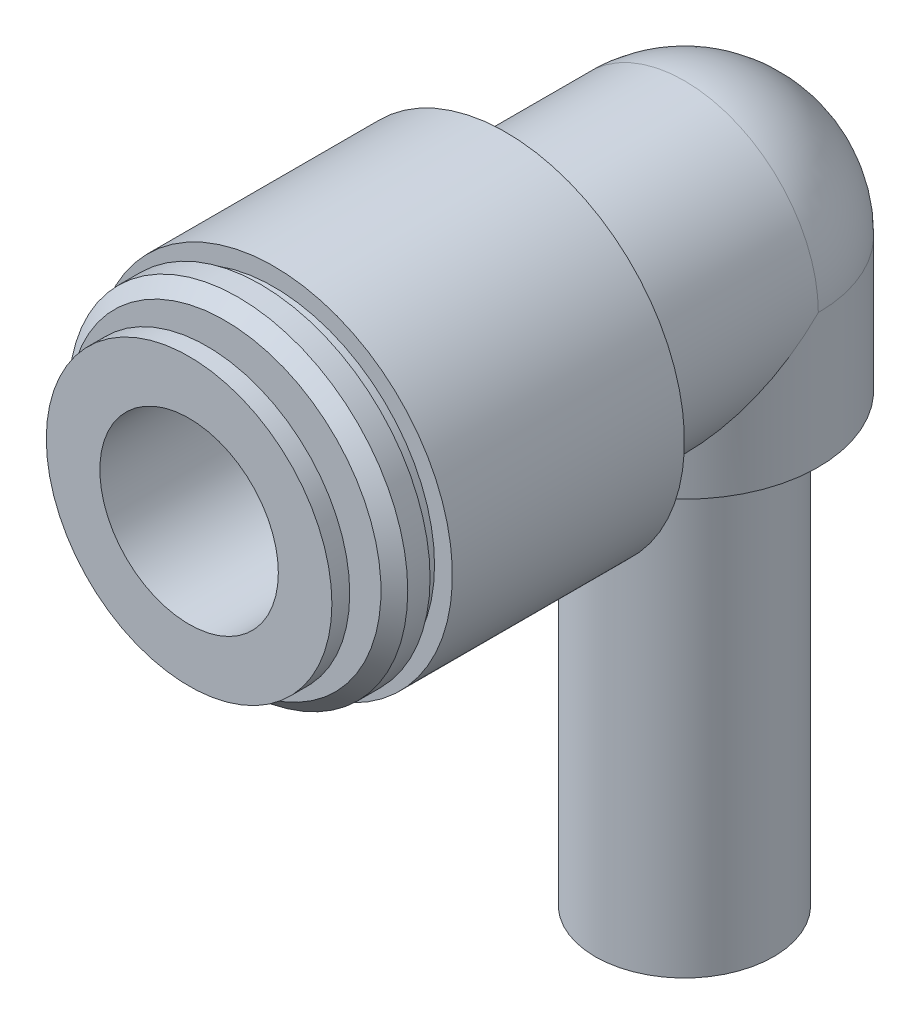
ISO-10303-21;
HEADER;
FILE_DESCRIPTION(('STEP AP214'),'2;1');
FILE_NAME('part.step','',(''),(''),'','','');
FILE_SCHEMA(('AUTOMOTIVE_DESIGN { 1 0 10303 214 1 1 1 1 }'));
ENDSEC;
DATA;
#1=APPLICATION_CONTEXT('core data for automotive mechanical design processes');
#2=APPLICATION_PROTOCOL_DEFINITION('international standard','automotive_design',2000,#1);
#3=PRODUCT_CONTEXT('',#1,'mechanical');
#4=PRODUCT('Part','Part','',(#3));
#5=PRODUCT_RELATED_PRODUCT_CATEGORY('part','',(#4));
#6=PRODUCT_DEFINITION_FORMATION('','',#4);
#7=PRODUCT_DEFINITION_CONTEXT('part definition',#1,'design');
#8=PRODUCT_DEFINITION('design','',#6,#7);
#9=PRODUCT_DEFINITION_SHAPE('','',#8);
#10=(LENGTH_UNIT() NAMED_UNIT(*) SI_UNIT(.MILLI.,.METRE.));
#11=(NAMED_UNIT(*) PLANE_ANGLE_UNIT() SI_UNIT($,.RADIAN.));
#12=(NAMED_UNIT(*) SI_UNIT($,.STERADIAN.) SOLID_ANGLE_UNIT());
#13=UNCERTAINTY_MEASURE_WITH_UNIT(LENGTH_MEASURE(1.E-05),#10,'distance_accuracy_value','');
#14=(GEOMETRIC_REPRESENTATION_CONTEXT(3) GLOBAL_UNCERTAINTY_ASSIGNED_CONTEXT((#13)) GLOBAL_UNIT_ASSIGNED_CONTEXT((#10,
#11,#12)) REPRESENTATION_CONTEXT('',''));
#15=CARTESIAN_POINT('',(0.,0.,0.));
#16=DIRECTION('',(0.,0.,1.));
#17=DIRECTION('',(1.,0.,0.));
#18=AXIS2_PLACEMENT_3D('',#15,#16,#17);
#19=CARTESIAN_POINT('',(0.,25.,0.));
#20=DIRECTION('',(0.,-1.,0.));
#21=DIRECTION('',(0.,0.,-1.));
#22=AXIS2_PLACEMENT_3D('',#19,#20,#21);
#23=CYLINDRICAL_SURFACE('',#22,7.5);
#24=CARTESIAN_POINT('',(0.,32.5,0.));
#25=DIRECTION('',(0.,-1.,0.));
#26=DIRECTION('',(0.,0.,-1.));
#27=AXIS2_PLACEMENT_3D('',#24,#25,#26);
#28=CIRCLE('',#27,7.5);
#29=CARTESIAN_POINT('',(-7.5,32.5,0.));
#30=VERTEX_POINT('',#29);
#31=CARTESIAN_POINT('',(7.5,32.5,0.));
#32=VERTEX_POINT('',#31);
#33=EDGE_CURVE('E68',#30,#32,#28,.T.);
#34=ORIENTED_EDGE('',*,*,#33,.T.);
#35=CARTESIAN_POINT('',(0.,32.5,0.));
#36=DIRECTION('',(0.,-0.707106781186547,-0.707106781186547));
#37=DIRECTION('',(0.,-0.707106781186547,0.707106781186547));
#38=AXIS2_PLACEMENT_3D('',#35,#36,#37);
#39=ELLIPSE('',#38,10.6066017177982,7.5);
#40=CARTESIAN_POINT('',(0.,25.,7.5));
#41=VERTEX_POINT('',#40);
#42=EDGE_CURVE('E51',#32,#41,#39,.T.);
#43=ORIENTED_EDGE('',*,*,#42,.T.);
#44=CARTESIAN_POINT('',(0.,25.,0.));
#45=DIRECTION('',(0.,-1.,0.));
#46=DIRECTION('',(0.,0.,-1.));
#47=AXIS2_PLACEMENT_3D('',#44,#45,#46);
#48=CIRCLE('',#47,7.5);
#49=EDGE_CURVE('E70',#41,#41,#48,.T.);
#50=ORIENTED_EDGE('',*,*,#49,.F.);
#51=EDGE_CURVE('E55',#41,#30,#39,.T.);
#52=ORIENTED_EDGE('',*,*,#51,.T.);
#53=EDGE_LOOP('',(#34,#43,#50,#52));
#54=FACE_BOUND('',#53,.T.);
#55=ADVANCED_FACE('F36',(#54),#23,.T.);
#56=CARTESIAN_POINT('',(0.,32.5,0.));
#57=DIRECTION('',(0.,-1.,0.));
#58=DIRECTION('',(1.,0.,0.));
#59=AXIS2_PLACEMENT_3D('',#56,#57,#58);
#60=SPHERICAL_SURFACE('',#59,7.5);
#61=ORIENTED_EDGE('',*,*,#33,.F.);
#62=CARTESIAN_POINT('',(0.,32.5,0.));
#63=DIRECTION('',(0.,0.,1.));
#64=DIRECTION('',(1.,0.,0.));
#65=AXIS2_PLACEMENT_3D('',#62,#63,#64);
#66=CIRCLE('',#65,7.5);
#67=EDGE_CURVE('E57',#32,#30,#66,.T.);
#68=ORIENTED_EDGE('',*,*,#67,.F.);
#69=EDGE_LOOP('',(#61,#68));
#70=FACE_BOUND('',#69,.T.);
#71=ADVANCED_FACE('F72',(#70),#60,.T.);
#72=CARTESIAN_POINT('',(0.,0.,0.));
#73=DIRECTION('',(0.,1.,0.));
#74=DIRECTION('',(0.,0.,1.));
#75=AXIS2_PLACEMENT_3D('',#72,#73,#74);
#76=PLANE('',#75);
#77=CARTESIAN_POINT('',(0.,0.,0.));
#78=DIRECTION('',(0.,1.,0.));
#79=DIRECTION('',(0.,0.,1.));
#80=AXIS2_PLACEMENT_3D('',#77,#78,#79);
#81=CIRCLE('',#80,5.);
#82=CARTESIAN_POINT('',(0.,0.,5.));
#83=VERTEX_POINT('',#82);
#84=EDGE_CURVE('E40',#83,#83,#81,.T.);
#85=ORIENTED_EDGE('',*,*,#84,.F.);
#86=EDGE_LOOP('',(#85));
#87=FACE_BOUND('',#86,.T.);
#88=CARTESIAN_POINT('',(0.,0.,0.));
#89=DIRECTION('',(0.,1.,0.));
#90=DIRECTION('',(0.,0.,1.));
#91=AXIS2_PLACEMENT_3D('',#88,#89,#90);
#92=CIRCLE('',#91,4.);
#93=CARTESIAN_POINT('',(0.,0.,4.));
#94=VERTEX_POINT('',#93);
#95=EDGE_CURVE('E79',#94,#94,#92,.T.);
#96=ORIENTED_EDGE('',*,*,#95,.T.);
#97=EDGE_LOOP('',(#96));
#98=FACE_BOUND('',#97,.T.);
#99=ADVANCED_FACE('F87',(#87,#98),#76,.F.);
#100=CARTESIAN_POINT('',(0.,25.,0.));
#101=DIRECTION('',(0.,-1.,0.));
#102=DIRECTION('',(0.,0.,-1.));
#103=AXIS2_PLACEMENT_3D('',#100,#101,#102);
#104=CYLINDRICAL_SURFACE('',#103,5.);
#105=CARTESIAN_POINT('',(0.,25.,0.));
#106=DIRECTION('',(0.,1.,0.));
#107=DIRECTION('',(0.,0.,1.));
#108=AXIS2_PLACEMENT_3D('',#105,#106,#107);
#109=CIRCLE('',#108,5.);
#110=CARTESIAN_POINT('',(0.,25.,5.));
#111=VERTEX_POINT('',#110);
#112=EDGE_CURVE('E11',#111,#111,#109,.T.);
#113=ORIENTED_EDGE('',*,*,#112,.F.);
#114=EDGE_LOOP('',(#113));
#115=FACE_BOUND('',#114,.T.);
#116=ORIENTED_EDGE('',*,*,#84,.T.);
#117=EDGE_LOOP('',(#116));
#118=FACE_BOUND('',#117,.T.);
#119=ADVANCED_FACE('F38',(#115,#118),#104,.T.);
#120=CARTESIAN_POINT('',(0.,25.,0.));
#121=DIRECTION('',(0.,-1.,0.));
#122=DIRECTION('',(0.,0.,-1.));
#123=AXIS2_PLACEMENT_3D('',#120,#121,#122);
#124=CYLINDRICAL_SURFACE('',#123,4.);
#125=CARTESIAN_POINT('',(0.,25.,0.));
#126=DIRECTION('',(0.,1.,0.));
#127=DIRECTION('',(0.,0.,1.));
#128=AXIS2_PLACEMENT_3D('',#125,#126,#127);
#129=CIRCLE('',#128,4.);
#130=CARTESIAN_POINT('',(0.,25.,4.));
#131=VERTEX_POINT('',#130);
#132=EDGE_CURVE('E74',#131,#131,#129,.T.);
#133=ORIENTED_EDGE('',*,*,#132,.T.);
#134=EDGE_LOOP('',(#133));
#135=FACE_BOUND('',#134,.T.);
#136=ORIENTED_EDGE('',*,*,#95,.F.);
#137=EDGE_LOOP('',(#136));
#138=FACE_BOUND('',#137,.T.);
#139=ADVANCED_FACE('F93',(#135,#138),#124,.F.);
#140=CARTESIAN_POINT('',(0.,25.,0.));
#141=DIRECTION('',(0.,-1.,0.));
#142=DIRECTION('',(0.,0.,-1.));
#143=AXIS2_PLACEMENT_3D('',#140,#141,#142);
#144=PLANE('',#143);
#145=ORIENTED_EDGE('',*,*,#132,.F.);
#146=EDGE_LOOP('',(#145));
#147=FACE_BOUND('',#146,.T.);
#148=ADVANCED_FACE('F105',(#147),#144,.T.);
#149=ORIENTED_EDGE('',*,*,#49,.T.);
#150=EDGE_LOOP('',(#149));
#151=FACE_BOUND('',#150,.T.);
#152=ORIENTED_EDGE('',*,*,#112,.T.);
#153=EDGE_LOOP('',(#152));
#154=FACE_BOUND('',#153,.T.);
#155=ADVANCED_FACE('F103',(#151,#154),#144,.T.);
#156=CARTESIAN_POINT('',(0.,32.5,10.));
#157=DIRECTION('',(0.,0.,-1.));
#158=DIRECTION('',(-1.,0.,0.));
#159=AXIS2_PLACEMENT_3D('',#156,#157,#158);
#160=CYLINDRICAL_SURFACE('',#159,7.5);
#161=ORIENTED_EDGE('',*,*,#42,.F.);
#162=ORIENTED_EDGE('',*,*,#67,.T.);
#163=ORIENTED_EDGE('',*,*,#51,.F.);
#164=EDGE_LOOP('',(#161,#162,#163));
#165=FACE_BOUND('',#164,.T.);
#166=CARTESIAN_POINT('',(0.,32.5,10.));
#167=DIRECTION('',(0.,0.,1.));
#168=DIRECTION('',(1.,0.,0.));
#169=AXIS2_PLACEMENT_3D('',#166,#167,#168);
#170=CIRCLE('',#169,7.5);
#171=CARTESIAN_POINT('',(7.5,32.5,10.));
#172=VERTEX_POINT('',#171);
#173=EDGE_CURVE('E63',#172,#172,#170,.T.);
#174=ORIENTED_EDGE('',*,*,#173,.F.);
#175=EDGE_LOOP('',(#174));
#176=FACE_BOUND('',#175,.T.);
#177=ADVANCED_FACE('F58',(#165,#176),#160,.T.);
#178=CARTESIAN_POINT('',(0.,32.5,23.));
#179=DIRECTION('',(0.,0.,-1.));
#180=DIRECTION('',(-1.,0.,0.));
#181=AXIS2_PLACEMENT_3D('',#178,#179,#180);
#182=CYLINDRICAL_SURFACE('',#181,10.);
#183=CARTESIAN_POINT('',(0.,32.5,23.));
#184=DIRECTION('',(0.,0.,1.));
#185=DIRECTION('',(1.,0.,0.));
#186=AXIS2_PLACEMENT_3D('',#183,#184,#185);
#187=CIRCLE('',#186,10.);
#188=CARTESIAN_POINT('',(-10.,32.5,23.));
#189=VERTEX_POINT('',#188);
#190=EDGE_CURVE('E64',#189,#189,#187,.T.);
#191=CARTESIAN_POINT('',(0.,32.5,10.));
#192=DIRECTION('',(0.,0.,1.));
#193=DIRECTION('',(1.,0.,0.));
#194=AXIS2_PLACEMENT_3D('',#191,#192,#193);
#195=CIRCLE('',#194,10.);
#196=CARTESIAN_POINT('',(-10.,32.5,10.));
#197=VERTEX_POINT('',#196);
#198=EDGE_CURVE('E339',#197,#197,#195,.T.);
#199=CARTESIAN_POINT('',(-10.,32.5,23.));
#200=CARTESIAN_POINT('',(-10.,32.5,22.8645833333333));
#201=CARTESIAN_POINT('',(-10.,32.5,22.7291666666667));
#202=CARTESIAN_POINT('',(-10.,32.5,22.4583333333333));
#203=CARTESIAN_POINT('',(-10.,32.5,22.3229166666667));
#204=CARTESIAN_POINT('',(-10.,32.5,22.0520833333333));
#205=CARTESIAN_POINT('',(-10.,32.5,21.9166666666667));
#206=CARTESIAN_POINT('',(-10.,32.5,21.6458333333333));
#207=CARTESIAN_POINT('',(-10.,32.5,21.5104166666667));
#208=CARTESIAN_POINT('',(-10.,32.5,21.2395833333333));
#209=CARTESIAN_POINT('',(-10.,32.5,21.1041666666667));
#210=CARTESIAN_POINT('',(-10.,32.5,20.8333333333333));
#211=CARTESIAN_POINT('',(-10.,32.5,20.6979166666667));
#212=CARTESIAN_POINT('',(-10.,32.5,20.4270833333333));
#213=CARTESIAN_POINT('',(-10.,32.5,20.2916666666667));
#214=CARTESIAN_POINT('',(-10.,32.5,20.0208333333333));
#215=CARTESIAN_POINT('',(-10.,32.5,19.8854166666667));
#216=CARTESIAN_POINT('',(-10.,32.5,19.6145833333333));
#217=CARTESIAN_POINT('',(-10.,32.5,19.4791666666667));
#218=CARTESIAN_POINT('',(-10.,32.5,19.2083333333333));
#219=CARTESIAN_POINT('',(-10.,32.5,19.0729166666667));
#220=CARTESIAN_POINT('',(-10.,32.5,18.8020833333333));
#221=CARTESIAN_POINT('',(-10.,32.5,18.6666666666667));
#222=CARTESIAN_POINT('',(-10.,32.5,18.3958333333333));
#223=CARTESIAN_POINT('',(-10.,32.5,18.2604166666667));
#224=CARTESIAN_POINT('',(-10.,32.5,17.9895833333333));
#225=CARTESIAN_POINT('',(-10.,32.5,17.8541666666667));
#226=CARTESIAN_POINT('',(-10.,32.5,17.5833333333333));
#227=CARTESIAN_POINT('',(-10.,32.5,17.4479166666667));
#228=CARTESIAN_POINT('',(-10.,32.5,17.1770833333333));
#229=CARTESIAN_POINT('',(-10.,32.5,17.0416666666667));
#230=CARTESIAN_POINT('',(-10.,32.5,16.7708333333333));
#231=CARTESIAN_POINT('',(-10.,32.5,16.6354166666667));
#232=CARTESIAN_POINT('',(-10.,32.5,16.3645833333333));
#233=CARTESIAN_POINT('',(-10.,32.5,16.2291666666667));
#234=CARTESIAN_POINT('',(-10.,32.5,15.9583333333333));
#235=CARTESIAN_POINT('',(-10.,32.5,15.8229166666667));
#236=CARTESIAN_POINT('',(-10.,32.5,15.5520833333333));
#237=CARTESIAN_POINT('',(-10.,32.5,15.4166666666667));
#238=CARTESIAN_POINT('',(-10.,32.5,15.1458333333333));
#239=CARTESIAN_POINT('',(-10.,32.5,15.0104166666667));
#240=CARTESIAN_POINT('',(-10.,32.5,14.7395833333333));
#241=CARTESIAN_POINT('',(-10.,32.5,14.6041666666667));
#242=CARTESIAN_POINT('',(-10.,32.5,14.3333333333333));
#243=CARTESIAN_POINT('',(-10.,32.5,14.1979166666667));
#244=CARTESIAN_POINT('',(-10.,32.5,13.9270833333333));
#245=CARTESIAN_POINT('',(-10.,32.5,13.7916666666667));
#246=CARTESIAN_POINT('',(-10.,32.5,13.5208333333333));
#247=CARTESIAN_POINT('',(-10.,32.5,13.3854166666667));
#248=CARTESIAN_POINT('',(-10.,32.5,13.1145833333333));
#249=CARTESIAN_POINT('',(-10.,32.5,12.9791666666667));
#250=CARTESIAN_POINT('',(-10.,32.5,12.7083333333333));
#251=CARTESIAN_POINT('',(-10.,32.5,12.5729166666667));
#252=CARTESIAN_POINT('',(-10.,32.5,12.3020833333333));
#253=CARTESIAN_POINT('',(-10.,32.5,12.1666666666667));
#254=CARTESIAN_POINT('',(-10.,32.5,11.8958333333333));
#255=CARTESIAN_POINT('',(-10.,32.5,11.7604166666667));
#256=CARTESIAN_POINT('',(-10.,32.5,11.4895833333333));
#257=CARTESIAN_POINT('',(-10.,32.5,11.3541666666667));
#258=CARTESIAN_POINT('',(-10.,32.5,11.0833333333333));
#259=CARTESIAN_POINT('',(-10.,32.5,10.9479166666667));
#260=CARTESIAN_POINT('',(-10.,32.5,10.6770833333333));
#261=CARTESIAN_POINT('',(-10.,32.5,10.5416666666667));
#262=CARTESIAN_POINT('',(-10.,32.5,10.2708333333333));
#263=CARTESIAN_POINT('',(-10.,32.5,10.1354166666667));
#264=CARTESIAN_POINT('',(-10.,32.5,10.));
#265=B_SPLINE_CURVE_WITH_KNOTS('',3,(#199,#200,#201,#202,#203,#204,#205,#206,#207,#208,#209,
#210,#211,#212,#213,#214,#215,#216,#217,#218,#219,#220,#221,#222,#223,#224,#225,#226,#227,#228,
#229,#230,#231,#232,#233,#234,#235,#236,#237,#238,#239,#240,#241,#242,#243,#244,#245,#246,#247,
#248,#249,#250,#251,#252,#253,#254,#255,#256,#257,#258,#259,#260,#261,#262,#263,#264),
.UNSPECIFIED.,.F.,.F.,(4,2,2,2,2,2,2,2,2,2,2,2,2,2,2,2,2,2,2,2,2,2,2,2,2,2,2,2,2,2,2,2,4),(0.,
0.406249999999997,0.812499999999997,1.21875,1.625,2.03125,2.4375,2.84375,3.25,3.65625,4.0625,
4.46875,4.875,5.28125,5.6875,6.09375,6.5,6.90625,7.3125,7.71875,8.125,8.53124999999999,8.9375,
9.34375,9.75,10.15625,10.5625,10.96875,11.375,11.78125,12.1875,12.59375,13.),.UNSPECIFIED.);
#266=EDGE_CURVE('BSEAM127',#189,#197,#265,.T.);
#267=ORIENTED_EDGE('',*,*,#190,.F.);
#268=ORIENTED_EDGE('',*,*,#198,.T.);
#269=ORIENTED_EDGE('',*,*,#266,.T.);
#270=ORIENTED_EDGE('',*,*,#266,.F.);
#271=EDGE_LOOP('',(#267,#269,#268,#270));
#272=FACE_BOUND('',#271,.T.);
#273=ADVANCED_FACE('F127',(#272),#182,.T.);
#274=CARTESIAN_POINT('',(0.,32.5,23.));
#275=DIRECTION('',(0.,0.,1.));
#276=DIRECTION('',(1.,0.,0.));
#277=AXIS2_PLACEMENT_3D('',#274,#275,#276);
#278=PLANE('',#277);
#279=CARTESIAN_POINT('',(0.,32.5,23.));
#280=DIRECTION('',(0.,0.,-1.));
#281=DIRECTION('',(-1.,0.,0.));
#282=AXIS2_PLACEMENT_3D('',#279,#280,#281);
#283=CIRCLE('',#282,8.99999999999996);
#284=CARTESIAN_POINT('',(-8.99999999999996,32.5,23.));
#285=VERTEX_POINT('',#284);
#286=EDGE_CURVE('E307',#285,#285,#283,.T.);
#287=ORIENTED_EDGE('',*,*,#286,.T.);
#288=EDGE_LOOP('',(#287));
#289=FACE_BOUND('',#288,.T.);
#290=ORIENTED_EDGE('',*,*,#190,.T.);
#291=EDGE_LOOP('',(#290));
#292=FACE_BOUND('',#291,.T.);
#293=ADVANCED_FACE('F133',(#289,#292),#278,.T.);
#294=CARTESIAN_POINT('',(0.,32.5,10.));
#295=DIRECTION('',(0.,0.,1.));
#296=DIRECTION('',(1.,0.,0.));
#297=AXIS2_PLACEMENT_3D('',#294,#295,#296);
#298=PLANE('',#297);
#299=ORIENTED_EDGE('',*,*,#173,.T.);
#300=EDGE_LOOP('',(#299));
#301=FACE_BOUND('',#300,.T.);
#302=ORIENTED_EDGE('',*,*,#198,.F.);
#303=EDGE_LOOP('',(#302));
#304=FACE_BOUND('',#303,.T.);
#305=ADVANCED_FACE('F142',(#301,#304),#298,.F.);
#306=CARTESIAN_POINT('',(0.,28.5,27.75));
#307=DIRECTION('',(0.,0.,-1.));
#308=DIRECTION('',(-1.,0.,0.));
#309=AXIS2_PLACEMENT_3D('',#306,#307,#308);
#310=PLANE('',#309);
#311=CARTESIAN_POINT('',(0.,32.5,27.75));
#312=DIRECTION('',(0.,0.,1.));
#313=DIRECTION('',(1.,0.,0.));
#314=AXIS2_PLACEMENT_3D('',#311,#312,#313);
#315=CIRCLE('',#314,5.);
#316=CARTESIAN_POINT('',(5.,32.5,27.75));
#317=VERTEX_POINT('',#316);
#318=EDGE_CURVE('E308',#317,#317,#315,.T.);
#319=ORIENTED_EDGE('',*,*,#318,.F.);
#320=EDGE_LOOP('',(#319));
#321=FACE_BOUND('',#320,.T.);
#322=CARTESIAN_POINT('',(0.,32.5,27.75));
#323=DIRECTION('',(0.,0.,-1.));
#324=DIRECTION('',(-1.,0.,0.));
#325=AXIS2_PLACEMENT_3D('',#322,#323,#324);
#326=CIRCLE('',#325,8.);
#327=CARTESIAN_POINT('',(-8.,32.5,27.75));
#328=VERTEX_POINT('',#327);
#329=EDGE_CURVE('E336',#328,#328,#326,.T.);
#330=ORIENTED_EDGE('',*,*,#329,.F.);
#331=EDGE_LOOP('',(#330));
#332=FACE_BOUND('',#331,.T.);
#333=ADVANCED_FACE('F150',(#321,#332),#310,.F.);
#334=CARTESIAN_POINT('',(0.,32.5,23.));
#335=DIRECTION('',(0.,0.,-1.));
#336=DIRECTION('',(-1.,0.,0.));
#337=AXIS2_PLACEMENT_3D('',#334,#335,#336);
#338=CYLINDRICAL_SURFACE('',#337,8.);
#339=CARTESIAN_POINT('',(0.,32.5,26.7499999999999));
#340=DIRECTION('',(0.,0.,-1.));
#341=DIRECTION('',(-1.,0.,0.));
#342=AXIS2_PLACEMENT_3D('',#339,#340,#341);
#343=CIRCLE('',#342,8.);
#344=CARTESIAN_POINT('',(-8.,32.5,26.7499999999999));
#345=VERTEX_POINT('',#344);
#346=EDGE_CURVE('E333',#345,#345,#343,.T.);
#347=ORIENTED_EDGE('',*,*,#346,.F.);
#348=EDGE_LOOP('',(#347));
#349=FACE_BOUND('',#348,.T.);
#350=ORIENTED_EDGE('',*,*,#329,.T.);
#351=EDGE_LOOP('',(#350));
#352=FACE_BOUND('',#351,.T.);
#353=ADVANCED_FACE('F158',(#349,#352),#338,.T.);
#354=CARTESIAN_POINT('',(0.,24.5,26.7499999999999));
#355=DIRECTION('',(0.,0.,1.));
#356=DIRECTION('',(1.,0.,0.));
#357=AXIS2_PLACEMENT_3D('',#354,#355,#356);
#358=PLANE('',#357);
#359=CARTESIAN_POINT('',(0.,32.5,26.7499999999999));
#360=DIRECTION('',(0.,0.,-1.));
#361=DIRECTION('',(-1.,0.,0.));
#362=AXIS2_PLACEMENT_3D('',#359,#360,#361);
#363=CIRCLE('',#362,5.99999999999998);
#364=CARTESIAN_POINT('',(-5.99999999999998,32.5,26.7499999999999));
#365=VERTEX_POINT('',#364);
#366=EDGE_CURVE('E330',#365,#365,#363,.T.);
#367=ORIENTED_EDGE('',*,*,#366,.F.);
#368=EDGE_LOOP('',(#367));
#369=FACE_BOUND('',#368,.T.);
#370=ORIENTED_EDGE('',*,*,#346,.T.);
#371=EDGE_LOOP('',(#370));
#372=FACE_BOUND('',#371,.T.);
#373=ADVANCED_FACE('F166',(#369,#372),#358,.F.);
#374=CARTESIAN_POINT('',(0.,32.5,23.));
#375=DIRECTION('',(0.,0.,-1.));
#376=DIRECTION('',(-1.,0.,0.));
#377=AXIS2_PLACEMENT_3D('',#374,#375,#376);
#378=CYLINDRICAL_SURFACE('',#377,5.99999999999998);
#379=CARTESIAN_POINT('',(0.,32.5,25.75));
#380=DIRECTION('',(0.,0.,-1.));
#381=DIRECTION('',(-1.,0.,0.));
#382=AXIS2_PLACEMENT_3D('',#379,#380,#381);
#383=CIRCLE('',#382,5.99999999999998);
#384=CARTESIAN_POINT('',(-5.99999999999998,32.5,25.75));
#385=VERTEX_POINT('',#384);
#386=EDGE_CURVE('E327',#385,#385,#383,.T.);
#387=ORIENTED_EDGE('',*,*,#386,.F.);
#388=EDGE_LOOP('',(#387));
#389=FACE_BOUND('',#388,.T.);
#390=ORIENTED_EDGE('',*,*,#366,.T.);
#391=EDGE_LOOP('',(#390));
#392=FACE_BOUND('',#391,.T.);
#393=ADVANCED_FACE('F174',(#389,#392),#378,.T.);
#394=CARTESIAN_POINT('',(0.,26.5,25.75));
#395=DIRECTION('',(0.,0.,-1.));
#396=DIRECTION('',(-1.,0.,0.));
#397=AXIS2_PLACEMENT_3D('',#394,#395,#396);
#398=PLANE('',#397);
#399=CARTESIAN_POINT('',(0.,32.5,25.75));
#400=DIRECTION('',(0.,0.,-1.));
#401=DIRECTION('',(-1.,0.,0.));
#402=AXIS2_PLACEMENT_3D('',#399,#400,#401);
#403=CIRCLE('',#402,8.74999999999998);
#404=CARTESIAN_POINT('',(-8.74999999999998,32.5,25.75));
#405=VERTEX_POINT('',#404);
#406=EDGE_CURVE('E324',#405,#405,#403,.T.);
#407=ORIENTED_EDGE('',*,*,#406,.F.);
#408=EDGE_LOOP('',(#407));
#409=FACE_BOUND('',#408,.T.);
#410=ORIENTED_EDGE('',*,*,#386,.T.);
#411=EDGE_LOOP('',(#410));
#412=FACE_BOUND('',#411,.T.);
#413=ADVANCED_FACE('F182',(#409,#412),#398,.F.);
#414=CARTESIAN_POINT('',(0.,32.5,25.75));
#415=DIRECTION('',(0.,0.,-1.));
#416=DIRECTION('',(-1.,0.,0.));
#417=AXIS2_PLACEMENT_3D('',#414,#415,#416);
#418=CONICAL_SURFACE('',#417,8.74999999999998,0.785398163397448);
#419=CARTESIAN_POINT('',(0.,32.5,25.));
#420=DIRECTION('',(0.,0.,-1.));
#421=DIRECTION('',(-1.,0.,0.));
#422=AXIS2_PLACEMENT_3D('',#419,#420,#421);
#423=CIRCLE('',#422,9.49999999999998);
#424=CARTESIAN_POINT('',(-9.49999999999998,32.5,25.));
#425=VERTEX_POINT('',#424);
#426=EDGE_CURVE('E321',#425,#425,#423,.T.);
#427=ORIENTED_EDGE('',*,*,#426,.F.);
#428=EDGE_LOOP('',(#427));
#429=FACE_BOUND('',#428,.T.);
#430=ORIENTED_EDGE('',*,*,#406,.T.);
#431=EDGE_LOOP('',(#430));
#432=FACE_BOUND('',#431,.T.);
#433=ADVANCED_FACE('F189',(#429,#432),#418,.T.);
#434=CARTESIAN_POINT('',(0.,32.5,23.));
#435=DIRECTION('',(0.,0.,-1.));
#436=DIRECTION('',(-1.,0.,0.));
#437=AXIS2_PLACEMENT_3D('',#434,#435,#436);
#438=CYLINDRICAL_SURFACE('',#437,9.49999999999998);
#439=CARTESIAN_POINT('',(0.,32.5,23.75));
#440=DIRECTION('',(0.,0.,-1.));
#441=DIRECTION('',(-1.,0.,0.));
#442=AXIS2_PLACEMENT_3D('',#439,#440,#441);
#443=CIRCLE('',#442,9.49999999999998);
#444=CARTESIAN_POINT('',(-9.49999999999998,32.5,23.75));
#445=VERTEX_POINT('',#444);
#446=EDGE_CURVE('E318',#445,#445,#443,.T.);
#447=ORIENTED_EDGE('',*,*,#446,.F.);
#448=EDGE_LOOP('',(#447));
#449=FACE_BOUND('',#448,.T.);
#450=ORIENTED_EDGE('',*,*,#426,.T.);
#451=EDGE_LOOP('',(#450));
#452=FACE_BOUND('',#451,.T.);
#453=ADVANCED_FACE('F197',(#449,#452),#438,.T.);
#454=CARTESIAN_POINT('',(0.,23.,23.75));
#455=DIRECTION('',(0.,0.,1.));
#456=DIRECTION('',(1.,0.,0.));
#457=AXIS2_PLACEMENT_3D('',#454,#455,#456);
#458=PLANE('',#457);
#459=CARTESIAN_POINT('',(0.,32.5,23.75));
#460=DIRECTION('',(0.,0.,-1.));
#461=DIRECTION('',(-1.,0.,0.));
#462=AXIS2_PLACEMENT_3D('',#459,#460,#461);
#463=CIRCLE('',#462,8.99999999999996);
#464=CARTESIAN_POINT('',(-8.99999999999996,32.5,23.75));
#465=VERTEX_POINT('',#464);
#466=EDGE_CURVE('E311',#465,#465,#463,.T.);
#467=ORIENTED_EDGE('',*,*,#466,.F.);
#468=EDGE_LOOP('',(#467));
#469=FACE_BOUND('',#468,.T.);
#470=ORIENTED_EDGE('',*,*,#446,.T.);
#471=EDGE_LOOP('',(#470));
#472=FACE_BOUND('',#471,.T.);
#473=ADVANCED_FACE('F205',(#469,#472),#458,.F.);
#474=CARTESIAN_POINT('',(0.,32.5,23.));
#475=DIRECTION('',(0.,0.,-1.));
#476=DIRECTION('',(-1.,0.,0.));
#477=AXIS2_PLACEMENT_3D('',#474,#475,#476);
#478=CYLINDRICAL_SURFACE('',#477,8.99999999999996);
#479=ORIENTED_EDGE('',*,*,#286,.F.);
#480=EDGE_LOOP('',(#479));
#481=FACE_BOUND('',#480,.T.);
#482=ORIENTED_EDGE('',*,*,#466,.T.);
#483=EDGE_LOOP('',(#482));
#484=FACE_BOUND('',#483,.T.);
#485=ADVANCED_FACE('F213',(#481,#484),#478,.T.);
#486=CARTESIAN_POINT('',(0.,32.5,-0.249999999999979));
#487=DIRECTION('',(0.,0.,1.));
#488=DIRECTION('',(1.,0.,0.));
#489=AXIS2_PLACEMENT_3D('',#486,#487,#488);
#490=CYLINDRICAL_SURFACE('',#489,5.);
#491=CARTESIAN_POINT('',(0.,32.5,-0.249999999999979));
#492=DIRECTION('',(0.,0.,1.));
#493=DIRECTION('',(1.,0.,0.));
#494=AXIS2_PLACEMENT_3D('',#491,#492,#493);
#495=CIRCLE('',#494,5.);
#496=CARTESIAN_POINT('',(5.,32.5,-0.249999999999979));
#497=VERTEX_POINT('',#496);
#498=EDGE_CURVE('E306',#497,#497,#495,.T.);
#499=ORIENTED_EDGE('',*,*,#498,.F.);
#500=EDGE_LOOP('',(#499));
#501=FACE_BOUND('',#500,.T.);
#502=ORIENTED_EDGE('',*,*,#318,.T.);
#503=EDGE_LOOP('',(#502));
#504=FACE_BOUND('',#503,.T.);
#505=ADVANCED_FACE('F221',(#501,#504),#490,.F.);
#506=CARTESIAN_POINT('',(0.,32.5,-0.249999999999979));
#507=DIRECTION('',(0.,0.,1.));
#508=DIRECTION('',(1.,0.,0.));
#509=AXIS2_PLACEMENT_3D('',#506,#507,#508);
#510=PLANE('',#509);
#511=ORIENTED_EDGE('',*,*,#498,.T.);
#512=EDGE_LOOP('',(#511));
#513=FACE_BOUND('',#512,.T.);
#514=ADVANCED_FACE('F229',(#513),#510,.T.);
#515=CLOSED_SHELL('',(#55,#71,#99,#119,#139,#148,#155,#177,#273,#293,#305,#333,#353,#373,#393,
#413,#433,#453,#473,#485,#505,#514));
#516=MANIFOLD_SOLID_BREP('B2',#515);
#517=ADVANCED_BREP_SHAPE_REPRESENTATION('',(#18,#516),#14);
#518=SHAPE_DEFINITION_REPRESENTATION(#9,#517);
ENDSEC;
END-ISO-10303-21;
